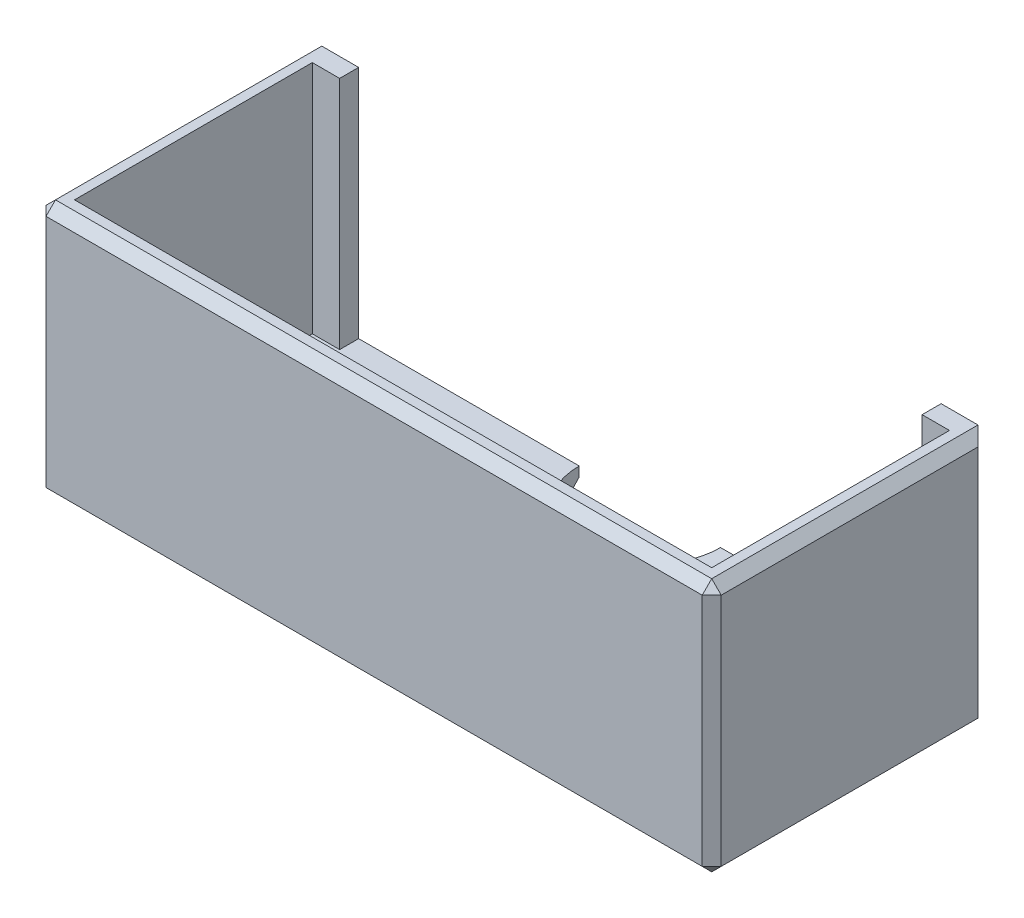
ISO-10303-21;
HEADER;
FILE_DESCRIPTION(('STEP AP214'),'2;1');
FILE_NAME('part.step','',(''),(''),'','','');
FILE_SCHEMA(('AUTOMOTIVE_DESIGN { 1 0 10303 214 1 1 1 1 }'));
ENDSEC;
DATA;
#1=APPLICATION_CONTEXT('core data for automotive mechanical design processes');
#2=APPLICATION_PROTOCOL_DEFINITION('international standard','automotive_design',2000,#1);
#3=PRODUCT_CONTEXT('',#1,'mechanical');
#4=PRODUCT('Part','Part','',(#3));
#5=PRODUCT_RELATED_PRODUCT_CATEGORY('part','',(#4));
#6=PRODUCT_DEFINITION_FORMATION('','',#4);
#7=PRODUCT_DEFINITION_CONTEXT('part definition',#1,'design');
#8=PRODUCT_DEFINITION('design','',#6,#7);
#9=PRODUCT_DEFINITION_SHAPE('','',#8);
#10=(LENGTH_UNIT() NAMED_UNIT(*) SI_UNIT(.MILLI.,.METRE.));
#11=(NAMED_UNIT(*) PLANE_ANGLE_UNIT() SI_UNIT($,.RADIAN.));
#12=(NAMED_UNIT(*) SI_UNIT($,.STERADIAN.) SOLID_ANGLE_UNIT());
#13=UNCERTAINTY_MEASURE_WITH_UNIT(LENGTH_MEASURE(1.E-05),#10,'distance_accuracy_value','');
#14=(GEOMETRIC_REPRESENTATION_CONTEXT(3) GLOBAL_UNCERTAINTY_ASSIGNED_CONTEXT((#13)) GLOBAL_UNIT_ASSIGNED_CONTEXT((#10,
#11,#12)) REPRESENTATION_CONTEXT('',''));
#15=CARTESIAN_POINT('',(0.,0.,0.));
#16=DIRECTION('',(0.,0.,1.));
#17=DIRECTION('',(1.,0.,0.));
#18=AXIS2_PLACEMENT_3D('',#15,#16,#17);
#19=CARTESIAN_POINT('',(0.,-24.7,-14.5));
#20=DIRECTION('',(0.,0.,-1.));
#21=DIRECTION('',(-1.,0.,0.));
#22=AXIS2_PLACEMENT_3D('',#19,#20,#21);
#23=PLANE('',#22);
#24=DIRECTION('',(0.,-1.,0.));
#25=VECTOR('',#24,1.);
#26=CARTESIAN_POINT('',(34.5,-24.7,-14.5));
#27=LINE('',#26,#25);
#28=CARTESIAN_POINT('',(34.5,0.,-14.5));
#29=VERTEX_POINT('',#28);
#30=CARTESIAN_POINT('',(34.5,-25.7,-14.5));
#31=VERTEX_POINT('',#30);
#32=EDGE_CURVE('E385',#29,#31,#27,.T.);
#33=ORIENTED_EDGE('',*,*,#32,.T.);
#34=DIRECTION('',(-1.,0.,0.));
#35=VECTOR('',#34,1.);
#36=CARTESIAN_POINT('',(0.,-25.7,-14.5));
#37=LINE('',#36,#35);
#38=CARTESIAN_POINT('',(7.43000000000001,-25.7,-14.5));
#39=VERTEX_POINT('',#38);
#40=EDGE_CURVE('E388',#31,#39,#37,.T.);
#41=ORIENTED_EDGE('',*,*,#40,.T.);
#42=DIRECTION('',(0.,1.,0.));
#43=VECTOR('',#42,1.);
#44=CARTESIAN_POINT('',(7.43000000000001,-26.7,-14.5));
#45=LINE('',#44,#43);
#46=CARTESIAN_POINT('',(7.43000000000001,-24.7,-14.5));
#47=VERTEX_POINT('',#46);
#48=EDGE_CURVE('E229',#39,#47,#45,.T.);
#49=ORIENTED_EDGE('',*,*,#48,.T.);
#50=DIRECTION('',(1.,0.,0.));
#51=VECTOR('',#50,1.);
#52=CARTESIAN_POINT('',(0.,-24.7,-14.5));
#53=LINE('',#52,#51);
#54=CARTESIAN_POINT('',(30.6233449090592,-24.7,-14.5));
#55=VERTEX_POINT('',#54);
#56=EDGE_CURVE('E240',#47,#55,#53,.T.);
#57=ORIENTED_EDGE('',*,*,#56,.T.);
#58=DIRECTION('',(0.,-1.,0.));
#59=VECTOR('',#58,1.);
#60=CARTESIAN_POINT('',(30.6233449090592,-24.7,-14.5));
#61=LINE('',#60,#59);
#62=CARTESIAN_POINT('',(30.6233449090592,0.,-14.5));
#63=VERTEX_POINT('',#62);
#64=EDGE_CURVE('E269',#63,#55,#61,.T.);
#65=ORIENTED_EDGE('',*,*,#64,.F.);
#66=DIRECTION('',(-1.,0.,0.));
#67=VECTOR('',#66,1.);
#68=CARTESIAN_POINT('',(0.,0.,-14.5));
#69=LINE('',#68,#67);
#70=EDGE_CURVE('E319',#29,#63,#69,.T.);
#71=ORIENTED_EDGE('',*,*,#70,.F.);
#72=EDGE_LOOP('',(#33,#41,#49,#57,#65,#71));
#73=FACE_BOUND('',#72,.T.);
#74=ADVANCED_FACE('F67',(#73),#23,.T.);
#75=CARTESIAN_POINT('',(-33.5,-24.7,-12.5));
#76=DIRECTION('',(0.,0.,-1.));
#77=DIRECTION('',(-1.,0.,0.));
#78=AXIS2_PLACEMENT_3D('',#75,#76,#77);
#79=PLANE('',#78);
#80=DIRECTION('',(-1.,0.,0.));
#81=VECTOR('',#80,1.);
#82=CARTESIAN_POINT('',(-33.5,0.,-12.5));
#83=LINE('',#82,#81);
#84=CARTESIAN_POINT('',(33.5,0.,-12.5));
#85=VERTEX_POINT('',#84);
#86=CARTESIAN_POINT('',(30.6233449090592,0.,-12.5));
#87=VERTEX_POINT('',#86);
#88=EDGE_CURVE('E294',#85,#87,#83,.T.);
#89=ORIENTED_EDGE('',*,*,#88,.T.);
#90=DIRECTION('',(0.,-1.,0.));
#91=VECTOR('',#90,1.);
#92=CARTESIAN_POINT('',(30.6233449090592,-24.7,-12.5));
#93=LINE('',#92,#91);
#94=CARTESIAN_POINT('',(30.6233449090592,-24.7,-12.5));
#95=VERTEX_POINT('',#94);
#96=EDGE_CURVE('E326',#87,#95,#93,.T.);
#97=ORIENTED_EDGE('',*,*,#96,.T.);
#98=DIRECTION('',(-1.,0.,0.));
#99=VECTOR('',#98,1.);
#100=CARTESIAN_POINT('',(-33.5,-24.7,-12.5));
#101=LINE('',#100,#99);
#102=CARTESIAN_POINT('',(33.5,-24.7,-12.5));
#103=VERTEX_POINT('',#102);
#104=EDGE_CURVE('E279',#103,#95,#101,.T.);
#105=ORIENTED_EDGE('',*,*,#104,.F.);
#106=DIRECTION('',(0.,1.,0.));
#107=VECTOR('',#106,1.);
#108=CARTESIAN_POINT('',(33.5,-24.7,-12.5));
#109=LINE('',#108,#107);
#110=EDGE_CURVE('E290',#103,#85,#109,.T.);
#111=ORIENTED_EDGE('',*,*,#110,.T.);
#112=EDGE_LOOP('',(#89,#97,#105,#111));
#113=FACE_BOUND('',#112,.T.);
#114=ADVANCED_FACE('F542',(#113),#79,.F.);
#115=CARTESIAN_POINT('',(35.5,-24.7,0.));
#116=DIRECTION('',(1.,0.,0.));
#117=DIRECTION('',(0.,0.,-1.));
#118=AXIS2_PLACEMENT_3D('',#115,#116,#117);
#119=PLANE('',#118);
#120=DIRECTION('',(0.,0.,1.));
#121=VECTOR('',#120,1.);
#122=CARTESIAN_POINT('',(35.5,-1.00000000000001,0.));
#123=LINE('',#122,#121);
#124=CARTESIAN_POINT('',(35.5,-1.00000000000001,-13.5));
#125=VERTEX_POINT('',#124);
#126=CARTESIAN_POINT('',(35.5,-1.00000000000001,13.5));
#127=VERTEX_POINT('',#126);
#128=EDGE_CURVE('E343',#125,#127,#123,.T.);
#129=ORIENTED_EDGE('',*,*,#128,.T.);
#130=DIRECTION('',(0.,-1.,0.));
#131=VECTOR('',#130,1.);
#132=CARTESIAN_POINT('',(35.5,-24.7,13.5));
#133=LINE('',#132,#131);
#134=CARTESIAN_POINT('',(35.5,-25.7,13.5));
#135=VERTEX_POINT('',#134);
#136=EDGE_CURVE('E352',#127,#135,#133,.T.);
#137=ORIENTED_EDGE('',*,*,#136,.T.);
#138=DIRECTION('',(0.,0.,-1.));
#139=VECTOR('',#138,1.);
#140=CARTESIAN_POINT('',(35.5,-25.7,0.));
#141=LINE('',#140,#139);
#142=CARTESIAN_POINT('',(35.5,-25.7,-13.5));
#143=VERTEX_POINT('',#142);
#144=EDGE_CURVE('E349',#135,#143,#141,.T.);
#145=ORIENTED_EDGE('',*,*,#144,.T.);
#146=DIRECTION('',(0.,1.,0.));
#147=VECTOR('',#146,1.);
#148=CARTESIAN_POINT('',(35.5,-24.7,-13.5));
#149=LINE('',#148,#147);
#150=EDGE_CURVE('E346',#143,#125,#149,.T.);
#151=ORIENTED_EDGE('',*,*,#150,.T.);
#152=EDGE_LOOP('',(#129,#137,#145,#151));
#153=FACE_BOUND('',#152,.T.);
#154=ADVANCED_FACE('F549',(#153),#119,.T.);
#155=CARTESIAN_POINT('',(0.,-24.7,14.5));
#156=DIRECTION('',(0.,0.,1.));
#157=DIRECTION('',(1.,0.,0.));
#158=AXIS2_PLACEMENT_3D('',#155,#156,#157);
#159=PLANE('',#158);
#160=DIRECTION('',(1.,0.,0.));
#161=VECTOR('',#160,1.);
#162=CARTESIAN_POINT('',(0.,-25.7,14.5));
#163=LINE('',#162,#161);
#164=CARTESIAN_POINT('',(-34.5,-25.7,14.5));
#165=VERTEX_POINT('',#164);
#166=CARTESIAN_POINT('',(34.5,-25.7,14.5));
#167=VERTEX_POINT('',#166);
#168=EDGE_CURVE('E336',#165,#167,#163,.T.);
#169=ORIENTED_EDGE('',*,*,#168,.T.);
#170=DIRECTION('',(0.,1.,0.));
#171=VECTOR('',#170,1.);
#172=CARTESIAN_POINT('',(34.5,-24.7,14.5));
#173=LINE('',#172,#171);
#174=CARTESIAN_POINT('',(34.5,-1.00000000000001,14.5));
#175=VERTEX_POINT('',#174);
#176=EDGE_CURVE('E339',#167,#175,#173,.T.);
#177=ORIENTED_EDGE('',*,*,#176,.T.);
#178=DIRECTION('',(-1.,0.,0.));
#179=VECTOR('',#178,1.);
#180=CARTESIAN_POINT('',(0.,-1.00000000000001,14.5));
#181=LINE('',#180,#179);
#182=CARTESIAN_POINT('',(-34.5,-1.00000000000001,14.5));
#183=VERTEX_POINT('',#182);
#184=EDGE_CURVE('E330',#175,#183,#181,.T.);
#185=ORIENTED_EDGE('',*,*,#184,.T.);
#186=DIRECTION('',(0.,-1.,0.));
#187=VECTOR('',#186,1.);
#188=CARTESIAN_POINT('',(-34.5,-24.7,14.5));
#189=LINE('',#188,#187);
#190=EDGE_CURVE('E333',#183,#165,#189,.T.);
#191=ORIENTED_EDGE('',*,*,#190,.T.);
#192=EDGE_LOOP('',(#169,#177,#185,#191));
#193=FACE_BOUND('',#192,.T.);
#194=ADVANCED_FACE('F561',(#193),#159,.T.);
#195=CARTESIAN_POINT('',(-35.5,-24.7,0.));
#196=DIRECTION('',(-1.,0.,0.));
#197=DIRECTION('',(0.,0.,1.));
#198=AXIS2_PLACEMENT_3D('',#195,#196,#197);
#199=PLANE('',#198);
#200=DIRECTION('',(0.,0.,1.));
#201=VECTOR('',#200,1.);
#202=CARTESIAN_POINT('',(-35.5,-25.7,0.));
#203=LINE('',#202,#201);
#204=CARTESIAN_POINT('',(-35.5,-25.7,-13.5));
#205=VERTEX_POINT('',#204);
#206=CARTESIAN_POINT('',(-35.5,-25.7,13.5));
#207=VERTEX_POINT('',#206);
#208=EDGE_CURVE('E372',#205,#207,#203,.T.);
#209=ORIENTED_EDGE('',*,*,#208,.T.);
#210=DIRECTION('',(0.,1.,0.));
#211=VECTOR('',#210,1.);
#212=CARTESIAN_POINT('',(-35.5,-24.7,13.5));
#213=LINE('',#212,#211);
#214=CARTESIAN_POINT('',(-35.5,-1.00000000000001,13.5));
#215=VERTEX_POINT('',#214);
#216=EDGE_CURVE('E381',#207,#215,#213,.T.);
#217=ORIENTED_EDGE('',*,*,#216,.T.);
#218=DIRECTION('',(0.,0.,-1.));
#219=VECTOR('',#218,1.);
#220=CARTESIAN_POINT('',(-35.5,-1.00000000000001,0.));
#221=LINE('',#220,#219);
#222=CARTESIAN_POINT('',(-35.5,-1.00000000000001,-13.5));
#223=VERTEX_POINT('',#222);
#224=EDGE_CURVE('E378',#215,#223,#221,.T.);
#225=ORIENTED_EDGE('',*,*,#224,.T.);
#226=DIRECTION('',(0.,-1.,0.));
#227=VECTOR('',#226,1.);
#228=CARTESIAN_POINT('',(-35.5,-24.7,-13.5));
#229=LINE('',#228,#227);
#230=EDGE_CURVE('E375',#223,#205,#229,.T.);
#231=ORIENTED_EDGE('',*,*,#230,.T.);
#232=EDGE_LOOP('',(#209,#217,#225,#231));
#233=FACE_BOUND('',#232,.T.);
#234=ADVANCED_FACE('F554',(#233),#199,.T.);
#235=DIRECTION('',(0.,1.,0.));
#236=VECTOR('',#235,1.);
#237=CARTESIAN_POINT('',(-7.42999999999999,-26.7,-14.5));
#238=LINE('',#237,#236);
#239=CARTESIAN_POINT('',(-7.42999999999999,-25.7,-14.5));
#240=VERTEX_POINT('',#239);
#241=CARTESIAN_POINT('',(-7.42999999999999,-24.7,-14.5));
#242=VERTEX_POINT('',#241);
#243=EDGE_CURVE('E218',#240,#242,#238,.T.);
#244=ORIENTED_EDGE('',*,*,#243,.F.);
#245=DIRECTION('',(-1.,0.,0.));
#246=VECTOR('',#245,1.);
#247=CARTESIAN_POINT('',(0.,-25.7,-14.5));
#248=LINE('',#247,#246);
#249=CARTESIAN_POINT('',(-34.5,-25.7,-14.5));
#250=VERTEX_POINT('',#249);
#251=EDGE_CURVE('E12',#240,#250,#248,.T.);
#252=ORIENTED_EDGE('',*,*,#251,.T.);
#253=DIRECTION('',(0.,1.,0.));
#254=VECTOR('',#253,1.);
#255=CARTESIAN_POINT('',(-34.5,-24.7,-14.5));
#256=LINE('',#255,#254);
#257=CARTESIAN_POINT('',(-34.5,0.,-14.5));
#258=VERTEX_POINT('',#257);
#259=EDGE_CURVE('E78',#250,#258,#256,.T.);
#260=ORIENTED_EDGE('',*,*,#259,.T.);
#261=CARTESIAN_POINT('',(-30.6233449090592,0.,-14.5));
#262=VERTEX_POINT('',#261);
#263=EDGE_CURVE('E308',#262,#258,#69,.T.);
#264=ORIENTED_EDGE('',*,*,#263,.F.);
#265=DIRECTION('',(0.,1.,0.));
#266=VECTOR('',#265,1.);
#267=CARTESIAN_POINT('',(-30.6233449090592,-24.7,-14.5));
#268=LINE('',#267,#266);
#269=CARTESIAN_POINT('',(-30.6233449090592,-24.7,-14.5));
#270=VERTEX_POINT('',#269);
#271=EDGE_CURVE('E236',#270,#262,#268,.T.);
#272=ORIENTED_EDGE('',*,*,#271,.F.);
#273=EDGE_CURVE('E233',#270,#242,#53,.T.);
#274=ORIENTED_EDGE('',*,*,#273,.T.);
#275=EDGE_LOOP('',(#244,#252,#260,#264,#272,#274));
#276=FACE_BOUND('',#275,.T.);
#277=ADVANCED_FACE('F234',(#276),#23,.T.);
#278=CARTESIAN_POINT('',(0.,0.,0.));
#279=DIRECTION('',(0.,1.,0.));
#280=DIRECTION('',(0.,0.,1.));
#281=AXIS2_PLACEMENT_3D('',#278,#279,#280);
#282=PLANE('',#281);
#283=DIRECTION('',(1.,0.,0.));
#284=VECTOR('',#283,1.);
#285=CARTESIAN_POINT('',(0.,0.,13.5));
#286=LINE('',#285,#284);
#287=CARTESIAN_POINT('',(-34.5,0.,13.5));
#288=VERTEX_POINT('',#287);
#289=CARTESIAN_POINT('',(34.5,0.,13.5));
#290=VERTEX_POINT('',#289);
#291=EDGE_CURVE('E92',#288,#290,#286,.T.);
#292=ORIENTED_EDGE('',*,*,#291,.T.);
#293=DIRECTION('',(0.,0.,-1.));
#294=VECTOR('',#293,1.);
#295=CARTESIAN_POINT('',(34.5,0.,0.));
#296=LINE('',#295,#294);
#297=EDGE_CURVE('E401',#290,#29,#296,.T.);
#298=ORIENTED_EDGE('',*,*,#297,.T.);
#299=ORIENTED_EDGE('',*,*,#70,.T.);
#300=DIRECTION('',(0.,0.,-1.));
#301=VECTOR('',#300,1.);
#302=CARTESIAN_POINT('',(30.6233449090592,0.,0.));
#303=LINE('',#302,#301);
#304=EDGE_CURVE('E265',#87,#63,#303,.T.);
#305=ORIENTED_EDGE('',*,*,#304,.F.);
#306=ORIENTED_EDGE('',*,*,#88,.F.);
#307=DIRECTION('',(0.,0.,-1.));
#308=VECTOR('',#307,1.);
#309=CARTESIAN_POINT('',(33.5,0.,12.5));
#310=LINE('',#309,#308);
#311=CARTESIAN_POINT('',(33.5,0.,12.5));
#312=VERTEX_POINT('',#311);
#313=EDGE_CURVE('E272',#312,#85,#310,.T.);
#314=ORIENTED_EDGE('',*,*,#313,.F.);
#315=DIRECTION('',(1.,0.,0.));
#316=VECTOR('',#315,1.);
#317=CARTESIAN_POINT('',(-33.5,0.,12.5));
#318=LINE('',#317,#316);
#319=CARTESIAN_POINT('',(-33.5,0.,12.5));
#320=VERTEX_POINT('',#319);
#321=EDGE_CURVE('E278',#320,#312,#318,.T.);
#322=ORIENTED_EDGE('',*,*,#321,.F.);
#323=DIRECTION('',(0.,0.,1.));
#324=VECTOR('',#323,1.);
#325=CARTESIAN_POINT('',(-33.5,0.,12.5));
#326=LINE('',#325,#324);
#327=CARTESIAN_POINT('',(-33.5,0.,-12.5));
#328=VERTEX_POINT('',#327);
#329=EDGE_CURVE('E298',#328,#320,#326,.T.);
#330=ORIENTED_EDGE('',*,*,#329,.F.);
#331=CARTESIAN_POINT('',(-30.6233449090592,0.,-12.5));
#332=VERTEX_POINT('',#331);
#333=EDGE_CURVE('E293',#332,#328,#83,.T.);
#334=ORIENTED_EDGE('',*,*,#333,.F.);
#335=DIRECTION('',(0.,0.,1.));
#336=VECTOR('',#335,1.);
#337=CARTESIAN_POINT('',(-30.6233449090592,0.,0.));
#338=LINE('',#337,#336);
#339=EDGE_CURVE('E260',#262,#332,#338,.T.);
#340=ORIENTED_EDGE('',*,*,#339,.F.);
#341=ORIENTED_EDGE('',*,*,#263,.T.);
#342=DIRECTION('',(0.,0.,1.));
#343=VECTOR('',#342,1.);
#344=CARTESIAN_POINT('',(-34.5,0.,0.));
#345=LINE('',#344,#343);
#346=EDGE_CURVE('E396',#258,#288,#345,.T.);
#347=ORIENTED_EDGE('',*,*,#346,.T.);
#348=EDGE_LOOP('',(#292,#298,#299,#305,#306,#314,#322,#330,#334,#340,#341,#347));
#349=FACE_BOUND('',#348,.T.);
#350=ADVANCED_FACE('F509',(#349),#282,.T.);
#351=CARTESIAN_POINT('',(33.5,-24.7,12.5));
#352=DIRECTION('',(1.,0.,0.));
#353=DIRECTION('',(0.,0.,-1.));
#354=AXIS2_PLACEMENT_3D('',#351,#352,#353);
#355=PLANE('',#354);
#356=ORIENTED_EDGE('',*,*,#313,.T.);
#357=ORIENTED_EDGE('',*,*,#110,.F.);
#358=DIRECTION('',(0.,0.,-1.));
#359=VECTOR('',#358,1.);
#360=CARTESIAN_POINT('',(33.5,-24.7,12.5));
#361=LINE('',#360,#359);
#362=CARTESIAN_POINT('',(33.5,-24.7,12.5));
#363=VERTEX_POINT('',#362);
#364=EDGE_CURVE('E273',#363,#103,#361,.T.);
#365=ORIENTED_EDGE('',*,*,#364,.F.);
#366=DIRECTION('',(0.,1.,0.));
#367=VECTOR('',#366,1.);
#368=CARTESIAN_POINT('',(33.5,-24.7,12.5));
#369=LINE('',#368,#367);
#370=EDGE_CURVE('E305',#363,#312,#369,.T.);
#371=ORIENTED_EDGE('',*,*,#370,.T.);
#372=EDGE_LOOP('',(#356,#357,#365,#371));
#373=FACE_BOUND('',#372,.T.);
#374=ADVANCED_FACE('F559',(#373),#355,.F.);
#375=CARTESIAN_POINT('',(-33.5,-24.7,12.5));
#376=DIRECTION('',(0.,0.,1.));
#377=DIRECTION('',(1.,0.,0.));
#378=AXIS2_PLACEMENT_3D('',#375,#376,#377);
#379=PLANE('',#378);
#380=ORIENTED_EDGE('',*,*,#321,.T.);
#381=ORIENTED_EDGE('',*,*,#370,.F.);
#382=DIRECTION('',(1.,0.,0.));
#383=VECTOR('',#382,1.);
#384=CARTESIAN_POINT('',(-33.5,-24.7,12.5));
#385=LINE('',#384,#383);
#386=CARTESIAN_POINT('',(-33.5,-24.7,12.5));
#387=VERTEX_POINT('',#386);
#388=EDGE_CURVE('E286',#387,#363,#385,.T.);
#389=ORIENTED_EDGE('',*,*,#388,.F.);
#390=DIRECTION('',(0.,1.,0.));
#391=VECTOR('',#390,1.);
#392=CARTESIAN_POINT('',(-33.5,-24.7,12.5));
#393=LINE('',#392,#391);
#394=EDGE_CURVE('E309',#387,#320,#393,.T.);
#395=ORIENTED_EDGE('',*,*,#394,.T.);
#396=EDGE_LOOP('',(#380,#381,#389,#395));
#397=FACE_BOUND('',#396,.T.);
#398=ADVANCED_FACE('F527',(#397),#379,.F.);
#399=CARTESIAN_POINT('',(-33.5,-24.7,12.5));
#400=DIRECTION('',(-1.,0.,0.));
#401=DIRECTION('',(0.,0.,1.));
#402=AXIS2_PLACEMENT_3D('',#399,#400,#401);
#403=PLANE('',#402);
#404=ORIENTED_EDGE('',*,*,#329,.T.);
#405=ORIENTED_EDGE('',*,*,#394,.F.);
#406=DIRECTION('',(0.,0.,1.));
#407=VECTOR('',#406,1.);
#408=CARTESIAN_POINT('',(-33.5,-24.7,12.5));
#409=LINE('',#408,#407);
#410=CARTESIAN_POINT('',(-33.5,-24.7,-12.5));
#411=VERTEX_POINT('',#410);
#412=EDGE_CURVE('E282',#411,#387,#409,.T.);
#413=ORIENTED_EDGE('',*,*,#412,.F.);
#414=DIRECTION('',(0.,1.,0.));
#415=VECTOR('',#414,1.);
#416=CARTESIAN_POINT('',(-33.5,-24.7,-12.5));
#417=LINE('',#416,#415);
#418=EDGE_CURVE('E312',#411,#328,#417,.T.);
#419=ORIENTED_EDGE('',*,*,#418,.T.);
#420=EDGE_LOOP('',(#404,#405,#413,#419));
#421=FACE_BOUND('',#420,.T.);
#422=ADVANCED_FACE('F522',(#421),#403,.F.);
#423=CARTESIAN_POINT('',(-30.6233449090592,-24.7,-12.5));
#424=VERTEX_POINT('',#423);
#425=EDGE_CURVE('E277',#424,#411,#101,.T.);
#426=ORIENTED_EDGE('',*,*,#425,.F.);
#427=DIRECTION('',(0.,1.,0.));
#428=VECTOR('',#427,1.);
#429=CARTESIAN_POINT('',(-30.6233449090592,-24.7,-12.5));
#430=LINE('',#429,#428);
#431=EDGE_CURVE('E322',#424,#332,#430,.T.);
#432=ORIENTED_EDGE('',*,*,#431,.T.);
#433=ORIENTED_EDGE('',*,*,#333,.T.);
#434=ORIENTED_EDGE('',*,*,#418,.F.);
#435=EDGE_LOOP('',(#426,#432,#433,#434));
#436=FACE_BOUND('',#435,.T.);
#437=ADVANCED_FACE('F519',(#436),#79,.F.);
#438=CARTESIAN_POINT('',(-30.6233449090592,-24.7,-4.16501992665497));
#439=DIRECTION('',(-1.,0.,0.));
#440=DIRECTION('',(0.,0.,1.));
#441=AXIS2_PLACEMENT_3D('',#438,#439,#440);
#442=PLANE('',#441);
#443=ORIENTED_EDGE('',*,*,#271,.T.);
#444=ORIENTED_EDGE('',*,*,#339,.T.);
#445=ORIENTED_EDGE('',*,*,#431,.F.);
#446=DIRECTION('',(0.,0.,1.));
#447=VECTOR('',#446,1.);
#448=CARTESIAN_POINT('',(-30.6233449090592,-24.7,-4.16501992665497));
#449=LINE('',#448,#447);
#450=EDGE_CURVE('E257',#270,#424,#449,.T.);
#451=ORIENTED_EDGE('',*,*,#450,.F.);
#452=EDGE_LOOP('',(#443,#444,#445,#451));
#453=FACE_BOUND('',#452,.T.);
#454=ADVANCED_FACE('F531',(#453),#442,.F.);
#455=CARTESIAN_POINT('',(30.6233449090592,-24.7,-4.16501992665497));
#456=DIRECTION('',(1.,0.,0.));
#457=DIRECTION('',(0.,0.,-1.));
#458=AXIS2_PLACEMENT_3D('',#455,#456,#457);
#459=PLANE('',#458);
#460=ORIENTED_EDGE('',*,*,#64,.T.);
#461=DIRECTION('',(0.,0.,-1.));
#462=VECTOR('',#461,1.);
#463=CARTESIAN_POINT('',(30.6233449090592,-24.7,-4.16501992665497));
#464=LINE('',#463,#462);
#465=EDGE_CURVE('E228',#95,#55,#464,.T.);
#466=ORIENTED_EDGE('',*,*,#465,.F.);
#467=ORIENTED_EDGE('',*,*,#96,.F.);
#468=ORIENTED_EDGE('',*,*,#304,.T.);
#469=EDGE_LOOP('',(#460,#466,#467,#468));
#470=FACE_BOUND('',#469,.T.);
#471=ADVANCED_FACE('F533',(#470),#459,.F.);
#472=CARTESIAN_POINT('',(0.,-24.7,0.));
#473=DIRECTION('',(0.,-1.,0.));
#474=DIRECTION('',(0.,0.,-1.));
#475=AXIS2_PLACEMENT_3D('',#472,#473,#474);
#476=PLANE('',#475);
#477=ORIENTED_EDGE('',*,*,#104,.T.);
#478=ORIENTED_EDGE('',*,*,#465,.T.);
#479=ORIENTED_EDGE('',*,*,#56,.F.);
#480=CARTESIAN_POINT('',(0.,-24.7,-14.5));
#481=DIRECTION('',(0.,-1.,0.));
#482=DIRECTION('',(0.,0.,-1.));
#483=AXIS2_PLACEMENT_3D('',#480,#481,#482);
#484=CIRCLE('',#483,7.43);
#485=EDGE_CURVE('E223',#47,#242,#484,.T.);
#486=ORIENTED_EDGE('',*,*,#485,.T.);
#487=ORIENTED_EDGE('',*,*,#273,.F.);
#488=ORIENTED_EDGE('',*,*,#450,.T.);
#489=ORIENTED_EDGE('',*,*,#425,.T.);
#490=ORIENTED_EDGE('',*,*,#412,.T.);
#491=ORIENTED_EDGE('',*,*,#388,.T.);
#492=ORIENTED_EDGE('',*,*,#364,.T.);
#493=EDGE_LOOP('',(#477,#478,#479,#486,#487,#488,#489,#490,#491,#492));
#494=FACE_BOUND('',#493,.T.);
#495=ADVANCED_FACE('F244',(#494),#476,.F.);
#496=CARTESIAN_POINT('',(0.,-26.7,-14.5));
#497=DIRECTION('',(0.,1.,0.));
#498=DIRECTION('',(0.,0.,1.));
#499=AXIS2_PLACEMENT_3D('',#496,#497,#498);
#500=CYLINDRICAL_SURFACE('',#499,7.43);
#501=ORIENTED_EDGE('',*,*,#48,.F.);
#502=CARTESIAN_POINT('',(0.,-25.7,-14.5));
#503=DIRECTION('',(0.,0.70710678118654,0.707106781186555));
#504=DIRECTION('',(0.,0.707106781186555,-0.70710678118654));
#505=AXIS2_PLACEMENT_3D('',#502,#503,#504);
#506=ELLIPSE('',#505,10.5076067684322,7.43);
#507=CARTESIAN_POINT('',(7.36239770726902,-26.7,-13.5));
#508=VERTEX_POINT('',#507);
#509=EDGE_CURVE('E393',#39,#508,#506,.F.);
#510=ORIENTED_EDGE('',*,*,#509,.T.);
#511=CARTESIAN_POINT('',(0.,-26.7,-14.5));
#512=DIRECTION('',(0.,-1.,0.));
#513=DIRECTION('',(0.,0.,-1.));
#514=AXIS2_PLACEMENT_3D('',#511,#512,#513);
#515=CIRCLE('',#514,7.43);
#516=CARTESIAN_POINT('',(-7.362397707269,-26.7,-13.5));
#517=VERTEX_POINT('',#516);
#518=EDGE_CURVE('E248',#508,#517,#515,.T.);
#519=ORIENTED_EDGE('',*,*,#518,.T.);
#520=CARTESIAN_POINT('',(0.,-25.7,-14.5));
#521=DIRECTION('',(0.,0.70710678118654,0.707106781186555));
#522=DIRECTION('',(0.,0.707106781186555,-0.70710678118654));
#523=AXIS2_PLACEMENT_3D('',#520,#521,#522);
#524=ELLIPSE('',#523,10.5076067684322,7.43);
#525=EDGE_CURVE('E226',#517,#240,#524,.F.);
#526=ORIENTED_EDGE('',*,*,#525,.T.);
#527=ORIENTED_EDGE('',*,*,#243,.T.);
#528=ORIENTED_EDGE('',*,*,#485,.F.);
#529=EDGE_LOOP('',(#501,#510,#519,#526,#527,#528));
#530=FACE_BOUND('',#529,.T.);
#531=ADVANCED_FACE('F221',(#530),#500,.F.);
#532=CARTESIAN_POINT('',(0.,-26.7,0.));
#533=DIRECTION('',(0.,-1.,0.));
#534=DIRECTION('',(0.,0.,-1.));
#535=AXIS2_PLACEMENT_3D('',#532,#533,#534);
#536=PLANE('',#535);
#537=ORIENTED_EDGE('',*,*,#518,.F.);
#538=DIRECTION('',(1.,0.,0.));
#539=VECTOR('',#538,1.);
#540=CARTESIAN_POINT('',(0.,-26.7,-13.5));
#541=LINE('',#540,#539);
#542=CARTESIAN_POINT('',(34.5,-26.7,-13.5));
#543=VERTEX_POINT('',#542);
#544=EDGE_CURVE('E369',#508,#543,#541,.T.);
#545=ORIENTED_EDGE('',*,*,#544,.T.);
#546=DIRECTION('',(0.,0.,1.));
#547=VECTOR('',#546,1.);
#548=CARTESIAN_POINT('',(34.5,-26.7,0.));
#549=LINE('',#548,#547);
#550=CARTESIAN_POINT('',(34.5,-26.7,13.5));
#551=VERTEX_POINT('',#550);
#552=EDGE_CURVE('E366',#543,#551,#549,.T.);
#553=ORIENTED_EDGE('',*,*,#552,.T.);
#554=DIRECTION('',(-1.,0.,0.));
#555=VECTOR('',#554,1.);
#556=CARTESIAN_POINT('',(0.,-26.7,13.5));
#557=LINE('',#556,#555);
#558=CARTESIAN_POINT('',(-34.5,-26.7,13.5));
#559=VERTEX_POINT('',#558);
#560=EDGE_CURVE('E362',#551,#559,#557,.T.);
#561=ORIENTED_EDGE('',*,*,#560,.T.);
#562=DIRECTION('',(0.,0.,-1.));
#563=VECTOR('',#562,1.);
#564=CARTESIAN_POINT('',(-34.5,-26.7,0.));
#565=LINE('',#564,#563);
#566=CARTESIAN_POINT('',(-34.5,-26.7,-13.5));
#567=VERTEX_POINT('',#566);
#568=EDGE_CURVE('E356',#559,#567,#565,.T.);
#569=ORIENTED_EDGE('',*,*,#568,.T.);
#570=DIRECTION('',(1.,0.,0.));
#571=VECTOR('',#570,1.);
#572=CARTESIAN_POINT('',(0.,-26.7,-13.5));
#573=LINE('',#572,#571);
#574=EDGE_CURVE('E359',#567,#517,#573,.T.);
#575=ORIENTED_EDGE('',*,*,#574,.T.);
#576=EDGE_LOOP('',(#537,#545,#553,#561,#569,#575));
#577=FACE_BOUND('',#576,.T.);
#578=ADVANCED_FACE('F497',(#577),#536,.T.);
#579=CARTESIAN_POINT('',(0.,-26.7,-13.5));
#580=DIRECTION('',(0.,0.70710678118654,0.707106781186555));
#581=DIRECTION('',(1.,0.,0.));
#582=AXIS2_PLACEMENT_3D('',#579,#580,#581);
#583=PLANE('',#582);
#584=DIRECTION('',(0.,0.707106781186555,-0.70710678118654));
#585=VECTOR('',#584,1.);
#586=CARTESIAN_POINT('',(-34.5,-25.7,-14.5));
#587=LINE('',#586,#585);
#588=EDGE_CURVE('E72',#250,#567,#587,.F.);
#589=ORIENTED_EDGE('',*,*,#588,.F.);
#590=ORIENTED_EDGE('',*,*,#251,.F.);
#591=ORIENTED_EDGE('',*,*,#525,.F.);
#592=ORIENTED_EDGE('',*,*,#574,.F.);
#593=EDGE_LOOP('',(#589,#590,#591,#592));
#594=FACE_BOUND('',#593,.T.);
#595=ADVANCED_FACE('F70',(#594),#583,.F.);
#596=CARTESIAN_POINT('',(-34.5,-25.7,-14.5));
#597=DIRECTION('',(-0.577350269189638,-0.577350269189614,-0.577350269189626));
#598=DIRECTION('',(-0.70710678118654,0.,0.707106781186555));
#599=AXIS2_PLACEMENT_3D('',#596,#597,#598);
#600=PLANE('',#599);
#601=DIRECTION('',(0.70710678118654,-0.707106781186555,0.));
#602=VECTOR('',#601,1.);
#603=CARTESIAN_POINT('',(-35.,-26.2,-13.5));
#604=LINE('',#603,#602);
#605=EDGE_CURVE('E470',#205,#567,#604,.T.);
#606=ORIENTED_EDGE('',*,*,#605,.F.);
#607=DIRECTION('',(-0.70710678118654,0.,0.707106781186555));
#608=VECTOR('',#607,1.);
#609=CARTESIAN_POINT('',(-34.5,-25.7,-14.5));
#610=LINE('',#609,#608);
#611=EDGE_CURVE('E473',#250,#205,#610,.T.);
#612=ORIENTED_EDGE('',*,*,#611,.F.);
#613=ORIENTED_EDGE('',*,*,#588,.T.);
#614=EDGE_LOOP('',(#606,#612,#613));
#615=FACE_BOUND('',#614,.T.);
#616=ADVANCED_FACE('F502',(#615),#600,.T.);
#617=CARTESIAN_POINT('',(-34.5,-24.7,-14.5));
#618=DIRECTION('',(0.707106781186555,0.,0.70710678118654));
#619=DIRECTION('',(0.,1.,0.));
#620=AXIS2_PLACEMENT_3D('',#617,#618,#619);
#621=PLANE('',#620);
#622=ORIENTED_EDGE('',*,*,#611,.T.);
#623=ORIENTED_EDGE('',*,*,#230,.F.);
#624=DIRECTION('',(0.577350269189618,0.57735026918963,-0.57735026918963));
#625=VECTOR('',#624,1.);
#626=CARTESIAN_POINT('',(-42.7333333333333,-8.23333333333345,-6.26666666666655));
#627=LINE('',#626,#625);
#628=EDGE_CURVE('E466',#258,#223,#627,.F.);
#629=ORIENTED_EDGE('',*,*,#628,.F.);
#630=ORIENTED_EDGE('',*,*,#259,.F.);
#631=EDGE_LOOP('',(#622,#623,#629,#630));
#632=FACE_BOUND('',#631,.T.);
#633=ADVANCED_FACE('F505',(#632),#621,.F.);
#634=CARTESIAN_POINT('',(0.,-26.7,-13.5));
#635=DIRECTION('',(0.,0.70710678118654,0.707106781186555));
#636=DIRECTION('',(1.,0.,0.));
#637=AXIS2_PLACEMENT_3D('',#634,#635,#636);
#638=PLANE('',#637);
#639=ORIENTED_EDGE('',*,*,#509,.F.);
#640=ORIENTED_EDGE('',*,*,#40,.F.);
#641=DIRECTION('',(0.,-0.707106781186555,0.70710678118654));
#642=VECTOR('',#641,1.);
#643=CARTESIAN_POINT('',(34.5,-26.7,-13.5));
#644=LINE('',#643,#642);
#645=EDGE_CURVE('E462',#543,#31,#644,.F.);
#646=ORIENTED_EDGE('',*,*,#645,.F.);
#647=ORIENTED_EDGE('',*,*,#544,.F.);
#648=EDGE_LOOP('',(#639,#640,#646,#647));
#649=FACE_BOUND('',#648,.T.);
#650=ADVANCED_FACE('F493',(#649),#638,.F.);
#651=CARTESIAN_POINT('',(-34.5,-26.7,0.));
#652=DIRECTION('',(0.707106781186555,0.70710678118654,0.));
#653=DIRECTION('',(0.,0.,-1.));
#654=AXIS2_PLACEMENT_3D('',#651,#652,#653);
#655=PLANE('',#654);
#656=ORIENTED_EDGE('',*,*,#605,.T.);
#657=ORIENTED_EDGE('',*,*,#568,.F.);
#658=DIRECTION('',(-0.70710678118654,0.707106781186555,0.));
#659=VECTOR('',#658,1.);
#660=CARTESIAN_POINT('',(-34.5,-26.7,13.5));
#661=LINE('',#660,#659);
#662=EDGE_CURVE('E458',#207,#559,#661,.F.);
#663=ORIENTED_EDGE('',*,*,#662,.F.);
#664=ORIENTED_EDGE('',*,*,#208,.F.);
#665=EDGE_LOOP('',(#656,#657,#663,#664));
#666=FACE_BOUND('',#665,.T.);
#667=ADVANCED_FACE('F695',(#666),#655,.F.);
#668=CARTESIAN_POINT('',(-35.5,-24.7,13.5));
#669=DIRECTION('',(0.707106781186555,0.,-0.70710678118654));
#670=DIRECTION('',(0.,1.,0.));
#671=AXIS2_PLACEMENT_3D('',#668,#669,#670);
#672=PLANE('',#671);
#673=DIRECTION('',(-0.70710678118654,0.,-0.707106781186555));
#674=VECTOR('',#673,1.);
#675=CARTESIAN_POINT('',(-35.5,-1.00000000000001,13.5));
#676=LINE('',#675,#674);
#677=EDGE_CURVE('E450',#215,#183,#676,.F.);
#678=ORIENTED_EDGE('',*,*,#677,.F.);
#679=ORIENTED_EDGE('',*,*,#216,.F.);
#680=DIRECTION('',(0.70710678118654,0.,0.707106781186555));
#681=VECTOR('',#680,1.);
#682=CARTESIAN_POINT('',(-35.,-25.7,14.));
#683=LINE('',#682,#681);
#684=EDGE_CURVE('E454',#165,#207,#683,.F.);
#685=ORIENTED_EDGE('',*,*,#684,.F.);
#686=ORIENTED_EDGE('',*,*,#190,.F.);
#687=EDGE_LOOP('',(#678,#679,#685,#686));
#688=FACE_BOUND('',#687,.T.);
#689=ADVANCED_FACE('F704',(#688),#672,.F.);
#690=CARTESIAN_POINT('',(-34.5,0.,0.));
#691=DIRECTION('',(0.707106781186555,-0.70710678118654,0.));
#692=DIRECTION('',(0.,0.,1.));
#693=AXIS2_PLACEMENT_3D('',#690,#691,#692);
#694=PLANE('',#693);
#695=ORIENTED_EDGE('',*,*,#628,.T.);
#696=ORIENTED_EDGE('',*,*,#224,.F.);
#697=DIRECTION('',(0.70710678118654,0.707106781186555,0.));
#698=VECTOR('',#697,1.);
#699=CARTESIAN_POINT('',(-35.5,-1.00000000000001,13.5));
#700=LINE('',#699,#698);
#701=EDGE_CURVE('E447',#288,#215,#700,.F.);
#702=ORIENTED_EDGE('',*,*,#701,.F.);
#703=ORIENTED_EDGE('',*,*,#346,.F.);
#704=EDGE_LOOP('',(#695,#696,#702,#703));
#705=FACE_BOUND('',#704,.T.);
#706=ADVANCED_FACE('F714',(#705),#694,.F.);
#707=CARTESIAN_POINT('',(34.5,-26.7,-13.5));
#708=DIRECTION('',(0.577350269189626,-0.577350269189614,-0.577350269189638));
#709=DIRECTION('',(-0.707106781186555,0.,-0.70710678118654));
#710=AXIS2_PLACEMENT_3D('',#707,#708,#709);
#711=PLANE('',#710);
#712=DIRECTION('',(0.70710678118654,0.707106781186555,0.));
#713=VECTOR('',#712,1.);
#714=CARTESIAN_POINT('',(34.5,-26.7,-13.5));
#715=LINE('',#714,#713);
#716=EDGE_CURVE('E439',#543,#143,#715,.T.);
#717=ORIENTED_EDGE('',*,*,#716,.F.);
#718=ORIENTED_EDGE('',*,*,#645,.T.);
#719=DIRECTION('',(-0.707106781186555,0.,-0.70710678118654));
#720=VECTOR('',#719,1.);
#721=CARTESIAN_POINT('',(35.,-25.7,-14.));
#722=LINE('',#721,#720);
#723=EDGE_CURVE('E443',#143,#31,#722,.T.);
#724=ORIENTED_EDGE('',*,*,#723,.F.);
#725=EDGE_LOOP('',(#717,#718,#724));
#726=FACE_BOUND('',#725,.T.);
#727=ADVANCED_FACE('F724',(#726),#711,.T.);
#728=CARTESIAN_POINT('',(-34.5,-26.7,13.5));
#729=DIRECTION('',(-0.577350269189638,-0.577350269189614,0.577350269189626));
#730=DIRECTION('',(0.70710678118654,0.,0.707106781186555));
#731=AXIS2_PLACEMENT_3D('',#728,#729,#730);
#732=PLANE('',#731);
#733=ORIENTED_EDGE('',*,*,#684,.T.);
#734=ORIENTED_EDGE('',*,*,#662,.T.);
#735=DIRECTION('',(0.,-0.707106781186555,-0.70710678118654));
#736=VECTOR('',#735,1.);
#737=CARTESIAN_POINT('',(-34.5,-26.7,13.5));
#738=LINE('',#737,#736);
#739=EDGE_CURVE('E436',#165,#559,#738,.T.);
#740=ORIENTED_EDGE('',*,*,#739,.F.);
#741=EDGE_LOOP('',(#733,#734,#740));
#742=FACE_BOUND('',#741,.T.);
#743=ADVANCED_FACE('F734',(#742),#732,.T.);
#744=CARTESIAN_POINT('',(-35.5,-1.00000000000001,13.5));
#745=DIRECTION('',(-0.577350269189638,0.577350269189614,0.577350269189626));
#746=DIRECTION('',(0.70710678118654,0.,0.707106781186555));
#747=AXIS2_PLACEMENT_3D('',#744,#745,#746);
#748=PLANE('',#747);
#749=ORIENTED_EDGE('',*,*,#701,.T.);
#750=ORIENTED_EDGE('',*,*,#677,.T.);
#751=DIRECTION('',(0.,-0.707106781186555,0.70710678118654));
#752=VECTOR('',#751,1.);
#753=CARTESIAN_POINT('',(-34.5,-0.500000000000004,14.));
#754=LINE('',#753,#752);
#755=EDGE_CURVE('E432',#288,#183,#754,.T.);
#756=ORIENTED_EDGE('',*,*,#755,.F.);
#757=EDGE_LOOP('',(#749,#750,#756));
#758=FACE_BOUND('',#757,.T.);
#759=ADVANCED_FACE('F744',(#758),#748,.T.);
#760=CARTESIAN_POINT('',(35.5,-24.7,-13.5));
#761=DIRECTION('',(-0.70710678118654,0.,0.707106781186555));
#762=DIRECTION('',(0.,1.,0.));
#763=AXIS2_PLACEMENT_3D('',#760,#761,#762);
#764=PLANE('',#763);
#765=ORIENTED_EDGE('',*,*,#723,.T.);
#766=ORIENTED_EDGE('',*,*,#32,.F.);
#767=DIRECTION('',(-0.577350269189626,0.577350269189638,-0.577350269189614));
#768=VECTOR('',#767,1.);
#769=CARTESIAN_POINT('',(39.3333333333333,-4.83333333333333,-9.66666666666685));
#770=LINE('',#769,#768);
#771=EDGE_CURVE('E428',#125,#29,#770,.T.);
#772=ORIENTED_EDGE('',*,*,#771,.F.);
#773=ORIENTED_EDGE('',*,*,#150,.F.);
#774=EDGE_LOOP('',(#765,#766,#772,#773));
#775=FACE_BOUND('',#774,.T.);
#776=ADVANCED_FACE('F754',(#775),#764,.F.);
#777=CARTESIAN_POINT('',(34.5,-26.7,0.));
#778=DIRECTION('',(-0.707106781186555,0.70710678118654,0.));
#779=DIRECTION('',(0.,0.,1.));
#780=AXIS2_PLACEMENT_3D('',#777,#778,#779);
#781=PLANE('',#780);
#782=ORIENTED_EDGE('',*,*,#716,.T.);
#783=ORIENTED_EDGE('',*,*,#144,.F.);
#784=DIRECTION('',(-0.70710678118654,-0.707106781186555,0.));
#785=VECTOR('',#784,1.);
#786=CARTESIAN_POINT('',(35.5,-25.7,13.5));
#787=LINE('',#786,#785);
#788=EDGE_CURVE('E424',#551,#135,#787,.F.);
#789=ORIENTED_EDGE('',*,*,#788,.F.);
#790=ORIENTED_EDGE('',*,*,#552,.F.);
#791=EDGE_LOOP('',(#782,#783,#789,#790));
#792=FACE_BOUND('',#791,.T.);
#793=ADVANCED_FACE('F764',(#792),#781,.F.);
#794=CARTESIAN_POINT('',(0.,-26.7,13.5));
#795=DIRECTION('',(0.,0.70710678118654,-0.707106781186555));
#796=DIRECTION('',(-1.,0.,0.));
#797=AXIS2_PLACEMENT_3D('',#794,#795,#796);
#798=PLANE('',#797);
#799=ORIENTED_EDGE('',*,*,#739,.T.);
#800=ORIENTED_EDGE('',*,*,#560,.F.);
#801=DIRECTION('',(0.,0.707106781186555,0.70710678118654));
#802=VECTOR('',#801,1.);
#803=CARTESIAN_POINT('',(34.5,-26.2,14.));
#804=LINE('',#803,#802);
#805=EDGE_CURVE('E420',#167,#551,#804,.F.);
#806=ORIENTED_EDGE('',*,*,#805,.F.);
#807=ORIENTED_EDGE('',*,*,#168,.F.);
#808=EDGE_LOOP('',(#799,#800,#806,#807));
#809=FACE_BOUND('',#808,.T.);
#810=ADVANCED_FACE('F774',(#809),#798,.F.);
#811=CARTESIAN_POINT('',(0.,0.,13.5));
#812=DIRECTION('',(0.,-0.70710678118654,-0.707106781186555));
#813=DIRECTION('',(1.,0.,0.));
#814=AXIS2_PLACEMENT_3D('',#811,#812,#813);
#815=PLANE('',#814);
#816=ORIENTED_EDGE('',*,*,#755,.T.);
#817=ORIENTED_EDGE('',*,*,#184,.F.);
#818=DIRECTION('',(0.,0.707106781186555,-0.70710678118654));
#819=VECTOR('',#818,1.);
#820=CARTESIAN_POINT('',(34.5,-1.00000000000001,14.5));
#821=LINE('',#820,#819);
#822=EDGE_CURVE('E416',#290,#175,#821,.F.);
#823=ORIENTED_EDGE('',*,*,#822,.F.);
#824=ORIENTED_EDGE('',*,*,#291,.F.);
#825=EDGE_LOOP('',(#816,#817,#823,#824));
#826=FACE_BOUND('',#825,.T.);
#827=ADVANCED_FACE('F784',(#826),#815,.F.);
#828=CARTESIAN_POINT('',(34.5,0.,0.));
#829=DIRECTION('',(-0.707106781186555,-0.70710678118654,0.));
#830=DIRECTION('',(0.,0.,-1.));
#831=AXIS2_PLACEMENT_3D('',#828,#829,#830);
#832=PLANE('',#831);
#833=ORIENTED_EDGE('',*,*,#771,.T.);
#834=ORIENTED_EDGE('',*,*,#297,.F.);
#835=DIRECTION('',(0.70710678118654,-0.707106781186555,0.));
#836=VECTOR('',#835,1.);
#837=CARTESIAN_POINT('',(35.,-0.500000000000004,13.5));
#838=LINE('',#837,#836);
#839=EDGE_CURVE('E412',#127,#290,#838,.F.);
#840=ORIENTED_EDGE('',*,*,#839,.F.);
#841=ORIENTED_EDGE('',*,*,#128,.F.);
#842=EDGE_LOOP('',(#833,#834,#840,#841));
#843=FACE_BOUND('',#842,.T.);
#844=ADVANCED_FACE('F794',(#843),#832,.F.);
#845=CARTESIAN_POINT('',(35.5,-25.7,13.5));
#846=DIRECTION('',(0.577350269189638,-0.577350269189614,0.577350269189626));
#847=DIRECTION('',(0.70710678118654,0.,-0.707106781186555));
#848=AXIS2_PLACEMENT_3D('',#845,#846,#847);
#849=PLANE('',#848);
#850=ORIENTED_EDGE('',*,*,#805,.T.);
#851=ORIENTED_EDGE('',*,*,#788,.T.);
#852=DIRECTION('',(0.70710678118654,0.,-0.707106781186555));
#853=VECTOR('',#852,1.);
#854=CARTESIAN_POINT('',(35.5,-25.7,13.5));
#855=LINE('',#854,#853);
#856=EDGE_CURVE('E409',#167,#135,#855,.T.);
#857=ORIENTED_EDGE('',*,*,#856,.F.);
#858=EDGE_LOOP('',(#850,#851,#857));
#859=FACE_BOUND('',#858,.T.);
#860=ADVANCED_FACE('F804',(#859),#849,.T.);
#861=CARTESIAN_POINT('',(34.5,-1.00000000000001,14.5));
#862=DIRECTION('',(0.577350269189638,0.577350269189614,0.577350269189626));
#863=DIRECTION('',(0.70710678118654,0.,-0.707106781186555));
#864=AXIS2_PLACEMENT_3D('',#861,#862,#863);
#865=PLANE('',#864);
#866=ORIENTED_EDGE('',*,*,#839,.T.);
#867=ORIENTED_EDGE('',*,*,#822,.T.);
#868=DIRECTION('',(-0.70710678118654,0.,0.707106781186555));
#869=VECTOR('',#868,1.);
#870=CARTESIAN_POINT('',(34.5,-1.00000000000001,14.5));
#871=LINE('',#870,#869);
#872=EDGE_CURVE('E406',#127,#175,#871,.T.);
#873=ORIENTED_EDGE('',*,*,#872,.F.);
#874=EDGE_LOOP('',(#866,#867,#873));
#875=FACE_BOUND('',#874,.T.);
#876=ADVANCED_FACE('F814',(#875),#865,.T.);
#877=CARTESIAN_POINT('',(34.5,-24.7,14.5));
#878=DIRECTION('',(-0.707106781186555,0.,-0.70710678118654));
#879=DIRECTION('',(0.,1.,0.));
#880=AXIS2_PLACEMENT_3D('',#877,#878,#879);
#881=PLANE('',#880);
#882=ORIENTED_EDGE('',*,*,#856,.T.);
#883=ORIENTED_EDGE('',*,*,#136,.F.);
#884=ORIENTED_EDGE('',*,*,#872,.T.);
#885=ORIENTED_EDGE('',*,*,#176,.F.);
#886=EDGE_LOOP('',(#882,#883,#884,#885));
#887=FACE_BOUND('',#886,.T.);
#888=ADVANCED_FACE('F824',(#887),#881,.F.);
#889=CLOSED_SHELL('',(#74,#114,#154,#194,#234,#277,#350,#374,#398,#422,#437,#454,#471,#495,#531,
#578,#595,#616,#633,#650,#667,#689,#706,#727,#743,#759,#776,#793,#810,#827,#844,#860,#876,#888));
#890=MANIFOLD_SOLID_BREP('B2',#889);
#891=ADVANCED_BREP_SHAPE_REPRESENTATION('',(#18,#890),#14);
#892=SHAPE_DEFINITION_REPRESENTATION(#9,#891);
ENDSEC;
END-ISO-10303-21;
